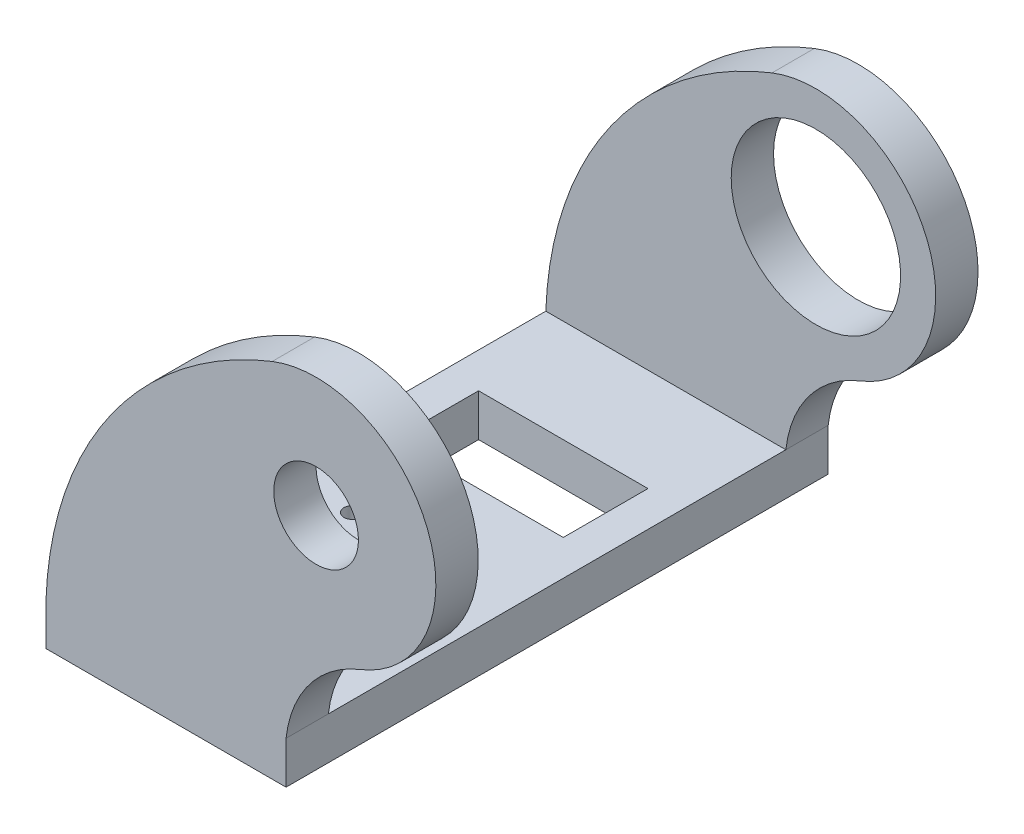
ISO-10303-21;
HEADER;
FILE_DESCRIPTION(('STEP AP214'),'2;1');
FILE_NAME('part.step','',(''),(''),'','','');
FILE_SCHEMA(('AUTOMOTIVE_DESIGN { 1 0 10303 214 1 1 1 1 }'));
ENDSEC;
DATA;
#1=APPLICATION_CONTEXT('core data for automotive mechanical design processes');
#2=APPLICATION_PROTOCOL_DEFINITION('international standard','automotive_design',2000,#1);
#3=PRODUCT_CONTEXT('',#1,'mechanical');
#4=PRODUCT('Part','Part','',(#3));
#5=PRODUCT_RELATED_PRODUCT_CATEGORY('part','',(#4));
#6=PRODUCT_DEFINITION_FORMATION('','',#4);
#7=PRODUCT_DEFINITION_CONTEXT('part definition',#1,'design');
#8=PRODUCT_DEFINITION('design','',#6,#7);
#9=PRODUCT_DEFINITION_SHAPE('','',#8);
#10=(LENGTH_UNIT() NAMED_UNIT(*) SI_UNIT(.MILLI.,.METRE.));
#11=(NAMED_UNIT(*) PLANE_ANGLE_UNIT() SI_UNIT($,.RADIAN.));
#12=(NAMED_UNIT(*) SI_UNIT($,.STERADIAN.) SOLID_ANGLE_UNIT());
#13=UNCERTAINTY_MEASURE_WITH_UNIT(LENGTH_MEASURE(1.E-05),#10,'distance_accuracy_value','');
#14=(GEOMETRIC_REPRESENTATION_CONTEXT(3) GLOBAL_UNCERTAINTY_ASSIGNED_CONTEXT((#13)) GLOBAL_UNIT_ASSIGNED_CONTEXT((#10,
#11,#12)) REPRESENTATION_CONTEXT('',''));
#15=CARTESIAN_POINT('',(0.,0.,0.));
#16=DIRECTION('',(0.,0.,1.));
#17=DIRECTION('',(1.,0.,0.));
#18=AXIS2_PLACEMENT_3D('',#15,#16,#17);
#19=CARTESIAN_POINT('',(57.0920106149906,42.9760565979538,0.));
#20=DIRECTION('',(0.,0.,1.));
#21=DIRECTION('',(1.,0.,0.));
#22=AXIS2_PLACEMENT_3D('',#19,#20,#21);
#23=PLANE('',#22);
#24=CARTESIAN_POINT('',(57.0920106149906,42.9760565979538,0.));
#25=DIRECTION('',(0.,0.,1.));
#26=DIRECTION('',(1.,0.,0.));
#27=AXIS2_PLACEMENT_3D('',#24,#25,#26);
#28=CIRCLE('',#27,5.);
#29=CARTESIAN_POINT('',(62.0920106149906,42.9760565979538,0.));
#30=VERTEX_POINT('',#29);
#31=EDGE_CURVE('E113',#30,#30,#28,.T.);
#32=ORIENTED_EDGE('',*,*,#31,.T.);
#33=EDGE_LOOP('',(#32));
#34=FACE_BOUND('',#33,.T.);
#35=DIRECTION('',(1.,0.,0.));
#36=VECTOR('',#35,1.);
#37=CARTESIAN_POINT('',(53.5458981834254,18.4188091808227,0.));
#38=LINE('',#37,#36);
#39=CARTESIAN_POINT('',(25.2039720357752,18.4188091808227,0.));
#40=VERTEX_POINT('',#39);
#41=CARTESIAN_POINT('',(53.5458981834254,18.4188091808227,0.));
#42=VERTEX_POINT('',#41);
#43=EDGE_CURVE('E141',#40,#42,#38,.T.);
#44=ORIENTED_EDGE('',*,*,#43,.F.);
#45=CARTESIAN_POINT('',(67.3687465397218,16.8754771948611,0.));
#46=DIRECTION('',(0.,0.,1.));
#47=DIRECTION('',(1.,0.,0.));
#48=AXIS2_PLACEMENT_3D('',#45,#46,#47);
#49=CIRCLE('',#48,42.1930098782673);
#50=CARTESIAN_POINT('',(51.910888918104,56.1349310924557,0.));
#51=VERTEX_POINT('',#50);
#52=EDGE_CURVE('E65',#51,#40,#49,.T.);
#53=ORIENTED_EDGE('',*,*,#52,.F.);
#54=CARTESIAN_POINT('',(57.0920106149906,42.9760565979538,0.));
#55=DIRECTION('',(0.,0.,1.));
#56=DIRECTION('',(1.,0.,0.));
#57=AXIS2_PLACEMENT_3D('',#54,#55,#56);
#58=CIRCLE('',#57,14.1421356237309);
#59=CARTESIAN_POINT('',(62.2731323118771,29.817182103452,0.));
#60=VERTEX_POINT('',#59);
#61=EDGE_CURVE('E116',#60,#51,#58,.T.);
#62=ORIENTED_EDGE('',*,*,#61,.F.);
#63=CARTESIAN_POINT('',(67.3687465397218,16.8754771948611,0.));
#64=DIRECTION('',(0.,0.,-1.));
#65=DIRECTION('',(1.,0.,0.));
#66=AXIS2_PLACEMENT_3D('',#63,#64,#65);
#67=CIRCLE('',#66,13.9087386308054);
#68=EDGE_CURVE('E119',#42,#60,#67,.T.);
#69=ORIENTED_EDGE('',*,*,#68,.F.);
#70=EDGE_LOOP('',(#44,#53,#62,#69));
#71=FACE_BOUND('',#70,.T.);
#72=ADVANCED_FACE('F36',(#34,#71),#23,.F.);
#73=CARTESIAN_POINT('',(57.0920106149906,42.9760565979538,5.));
#74=DIRECTION('',(0.,0.,-1.));
#75=DIRECTION('',(-1.,0.,0.));
#76=AXIS2_PLACEMENT_3D('',#73,#74,#75);
#77=CYLINDRICAL_SURFACE('',#76,14.1421356237309);
#78=ORIENTED_EDGE('',*,*,#61,.T.);
#79=DIRECTION('',(0.,0.,-1.));
#80=VECTOR('',#79,1.);
#81=CARTESIAN_POINT('',(51.910888918104,56.1349310924557,5.));
#82=LINE('',#81,#80);
#83=CARTESIAN_POINT('',(51.910888918104,56.1349310924557,5.));
#84=VERTEX_POINT('',#83);
#85=EDGE_CURVE('E11',#84,#51,#82,.T.);
#86=ORIENTED_EDGE('',*,*,#85,.F.);
#87=CARTESIAN_POINT('',(57.0920106149906,42.9760565979538,5.));
#88=DIRECTION('',(0.,0.,1.));
#89=DIRECTION('',(1.,0.,0.));
#90=AXIS2_PLACEMENT_3D('',#87,#88,#89);
#91=CIRCLE('',#90,14.1421356237309);
#92=CARTESIAN_POINT('',(62.2731323118771,29.817182103452,5.));
#93=VERTEX_POINT('',#92);
#94=EDGE_CURVE('E92',#93,#84,#91,.T.);
#95=ORIENTED_EDGE('',*,*,#94,.F.);
#96=DIRECTION('',(0.,0.,-1.));
#97=VECTOR('',#96,1.);
#98=CARTESIAN_POINT('',(62.2731323118771,29.817182103452,5.));
#99=LINE('',#98,#97);
#100=EDGE_CURVE('E122',#93,#60,#99,.T.);
#101=ORIENTED_EDGE('',*,*,#100,.T.);
#102=EDGE_LOOP('',(#78,#86,#95,#101));
#103=FACE_BOUND('',#102,.T.);
#104=ADVANCED_FACE('F38',(#103),#77,.T.);
#105=CARTESIAN_POINT('',(67.3687465397218,16.8754771948611,5.));
#106=DIRECTION('',(0.,0.,-1.));
#107=DIRECTION('',(-1.,0.,0.));
#108=AXIS2_PLACEMENT_3D('',#105,#106,#107);
#109=CYLINDRICAL_SURFACE('',#108,42.1930098782673);
#110=ORIENTED_EDGE('',*,*,#52,.T.);
#111=DIRECTION('',(0.,0.,-1.));
#112=VECTOR('',#111,1.);
#113=CARTESIAN_POINT('',(25.2039720357752,18.4188091808227,5.));
#114=LINE('',#113,#112);
#115=CARTESIAN_POINT('',(25.2039720357752,18.4188091808227,5.));
#116=VERTEX_POINT('',#115);
#117=EDGE_CURVE('E45',#116,#40,#114,.T.);
#118=ORIENTED_EDGE('',*,*,#117,.F.);
#119=CARTESIAN_POINT('',(67.3687465397218,16.8754771948611,5.));
#120=DIRECTION('',(0.,0.,1.));
#121=DIRECTION('',(1.,0.,0.));
#122=AXIS2_PLACEMENT_3D('',#119,#120,#121);
#123=CIRCLE('',#122,42.1930098782673);
#124=EDGE_CURVE('E85',#84,#116,#123,.T.);
#125=ORIENTED_EDGE('',*,*,#124,.F.);
#126=ORIENTED_EDGE('',*,*,#85,.T.);
#127=EDGE_LOOP('',(#110,#118,#125,#126));
#128=FACE_BOUND('',#127,.T.);
#129=ADVANCED_FACE('F97',(#128),#109,.T.);
#130=CARTESIAN_POINT('',(67.3687465397218,16.8754771948611,5.));
#131=DIRECTION('',(0.,0.,-1.));
#132=DIRECTION('',(-1.,0.,0.));
#133=AXIS2_PLACEMENT_3D('',#130,#131,#132);
#134=CYLINDRICAL_SURFACE('',#133,13.9087386308054);
#135=ORIENTED_EDGE('',*,*,#68,.T.);
#136=ORIENTED_EDGE('',*,*,#100,.F.);
#137=CARTESIAN_POINT('',(67.3687465397218,16.8754771948611,5.));
#138=DIRECTION('',(0.,0.,-1.));
#139=DIRECTION('',(1.,0.,0.));
#140=AXIS2_PLACEMENT_3D('',#137,#138,#139);
#141=CIRCLE('',#140,13.9087386308054);
#142=CARTESIAN_POINT('',(53.5458981834254,18.4188091808227,5.));
#143=VERTEX_POINT('',#142);
#144=EDGE_CURVE('E53',#143,#93,#141,.T.);
#145=ORIENTED_EDGE('',*,*,#144,.F.);
#146=DIRECTION('',(0.,0.,-1.));
#147=VECTOR('',#146,1.);
#148=CARTESIAN_POINT('',(53.5458981834254,18.4188091808227,5.));
#149=LINE('',#148,#147);
#150=EDGE_CURVE('E101',#143,#42,#149,.T.);
#151=ORIENTED_EDGE('',*,*,#150,.T.);
#152=EDGE_LOOP('',(#135,#136,#145,#151));
#153=FACE_BOUND('',#152,.T.);
#154=ADVANCED_FACE('F133',(#153),#134,.F.);
#155=CARTESIAN_POINT('',(57.0920106149906,42.9760565979538,5.));
#156=DIRECTION('',(0.,0.,1.));
#157=DIRECTION('',(1.,0.,0.));
#158=AXIS2_PLACEMENT_3D('',#155,#156,#157);
#159=PLANE('',#158);
#160=CARTESIAN_POINT('',(57.0920106149906,42.9760565979538,5.));
#161=DIRECTION('',(0.,0.,1.));
#162=DIRECTION('',(1.,0.,0.));
#163=AXIS2_PLACEMENT_3D('',#160,#161,#162);
#164=CIRCLE('',#163,5.);
#165=CARTESIAN_POINT('',(62.0920106149906,42.9760565979538,5.));
#166=VERTEX_POINT('',#165);
#167=EDGE_CURVE('E107',#166,#166,#164,.T.);
#168=ORIENTED_EDGE('',*,*,#167,.F.);
#169=EDGE_LOOP('',(#168));
#170=FACE_BOUND('',#169,.T.);
#171=ORIENTED_EDGE('',*,*,#94,.T.);
#172=ORIENTED_EDGE('',*,*,#124,.T.);
#173=DIRECTION('',(0.,1.,0.));
#174=VECTOR('',#173,1.);
#175=CARTESIAN_POINT('',(25.2039720357752,13.4188091808227,5.));
#176=LINE('',#175,#174);
#177=CARTESIAN_POINT('',(25.2039720357752,13.4188091808227,5.));
#178=VERTEX_POINT('',#177);
#179=EDGE_CURVE('E89',#178,#116,#176,.T.);
#180=ORIENTED_EDGE('',*,*,#179,.F.);
#181=DIRECTION('',(-1.,0.,0.));
#182=VECTOR('',#181,1.);
#183=CARTESIAN_POINT('',(53.5458981834254,13.4188091808227,5.));
#184=LINE('',#183,#182);
#185=CARTESIAN_POINT('',(53.5458981834254,13.4188091808227,5.));
#186=VERTEX_POINT('',#185);
#187=EDGE_CURVE('E75',#186,#178,#184,.T.);
#188=ORIENTED_EDGE('',*,*,#187,.F.);
#189=DIRECTION('',(0.,1.,0.));
#190=VECTOR('',#189,1.);
#191=CARTESIAN_POINT('',(53.5458981834254,13.4188091808227,5.));
#192=LINE('',#191,#190);
#193=EDGE_CURVE('E105',#186,#143,#192,.T.);
#194=ORIENTED_EDGE('',*,*,#193,.T.);
#195=ORIENTED_EDGE('',*,*,#144,.T.);
#196=EDGE_LOOP('',(#171,#172,#180,#188,#194,#195));
#197=FACE_BOUND('',#196,.T.);
#198=ADVANCED_FACE('F87',(#170,#197),#159,.T.);
#199=CARTESIAN_POINT('',(57.0920106149906,42.9760565979538,0.));
#200=DIRECTION('',(0.,0.,1.));
#201=DIRECTION('',(1.,0.,0.));
#202=AXIS2_PLACEMENT_3D('',#199,#200,#201);
#203=CYLINDRICAL_SURFACE('',#202,5.);
#204=ORIENTED_EDGE('',*,*,#31,.F.);
#205=EDGE_LOOP('',(#204));
#206=FACE_BOUND('',#205,.T.);
#207=ORIENTED_EDGE('',*,*,#167,.T.);
#208=EDGE_LOOP('',(#207));
#209=FACE_BOUND('',#208,.T.);
#210=ADVANCED_FACE('F344',(#206,#209),#203,.F.);
#211=CARTESIAN_POINT('',(25.2039720357752,13.4188091808227,5.));
#212=DIRECTION('',(1.,0.,0.));
#213=DIRECTION('',(0.,0.,-1.));
#214=AXIS2_PLACEMENT_3D('',#211,#212,#213);
#215=PLANE('',#214);
#216=ORIENTED_EDGE('',*,*,#117,.T.);
#217=DIRECTION('',(0.,0.,1.));
#218=VECTOR('',#217,1.);
#219=CARTESIAN_POINT('',(25.2039720357752,18.4188091808227,-31.9));
#220=LINE('',#219,#218);
#221=CARTESIAN_POINT('',(25.2039720357752,18.4188091808227,-54.01));
#222=VERTEX_POINT('',#221);
#223=EDGE_CURVE('E147',#222,#40,#220,.T.);
#224=ORIENTED_EDGE('',*,*,#223,.F.);
#225=DIRECTION('',(0.,0.,1.));
#226=VECTOR('',#225,1.);
#227=CARTESIAN_POINT('',(25.2039720357752,18.4188091808227,-59.01));
#228=LINE('',#227,#226);
#229=CARTESIAN_POINT('',(25.2039720357752,18.4188091808227,-59.01));
#230=VERTEX_POINT('',#229);
#231=EDGE_CURVE('E207',#230,#222,#228,.T.);
#232=ORIENTED_EDGE('',*,*,#231,.F.);
#233=DIRECTION('',(0.,1.,0.));
#234=VECTOR('',#233,1.);
#235=CARTESIAN_POINT('',(25.2039720357752,18.4188091808227,-59.01));
#236=LINE('',#235,#234);
#237=CARTESIAN_POINT('',(25.2039720357752,13.4188091808227,-59.01));
#238=VERTEX_POINT('',#237);
#239=EDGE_CURVE('E181',#238,#230,#236,.T.);
#240=ORIENTED_EDGE('',*,*,#239,.F.);
#241=DIRECTION('',(0.,0.,-1.));
#242=VECTOR('',#241,1.);
#243=CARTESIAN_POINT('',(25.2039720357752,13.4188091808227,5.));
#244=LINE('',#243,#242);
#245=EDGE_CURVE('E104',#178,#238,#244,.T.);
#246=ORIENTED_EDGE('',*,*,#245,.F.);
#247=ORIENTED_EDGE('',*,*,#179,.T.);
#248=EDGE_LOOP('',(#216,#224,#232,#240,#246,#247));
#249=FACE_BOUND('',#248,.T.);
#250=ADVANCED_FACE('F102',(#249),#215,.F.);
#251=CARTESIAN_POINT('',(53.5458981834254,13.4188091808227,0.));
#252=DIRECTION('',(-1.,0.,0.));
#253=DIRECTION('',(0.,0.,1.));
#254=AXIS2_PLACEMENT_3D('',#251,#252,#253);
#255=PLANE('',#254);
#256=ORIENTED_EDGE('',*,*,#150,.F.);
#257=ORIENTED_EDGE('',*,*,#193,.F.);
#258=DIRECTION('',(0.,0.,1.));
#259=VECTOR('',#258,1.);
#260=CARTESIAN_POINT('',(53.5458981834254,13.4188091808227,0.));
#261=LINE('',#260,#259);
#262=CARTESIAN_POINT('',(53.5458981834254,13.4188091808227,-59.01));
#263=VERTEX_POINT('',#262);
#264=EDGE_CURVE('E109',#263,#186,#261,.T.);
#265=ORIENTED_EDGE('',*,*,#264,.F.);
#266=DIRECTION('',(0.,-1.,0.));
#267=VECTOR('',#266,1.);
#268=CARTESIAN_POINT('',(53.5458981834254,18.4188091808227,-59.01));
#269=LINE('',#268,#267);
#270=CARTESIAN_POINT('',(53.5458981834254,18.4188091808227,-59.01));
#271=VERTEX_POINT('',#270);
#272=EDGE_CURVE('E169',#271,#263,#269,.T.);
#273=ORIENTED_EDGE('',*,*,#272,.F.);
#274=DIRECTION('',(0.,0.,1.));
#275=VECTOR('',#274,1.);
#276=CARTESIAN_POINT('',(53.5458981834254,18.4188091808227,-59.01));
#277=LINE('',#276,#275);
#278=CARTESIAN_POINT('',(53.5458981834254,18.4188091808227,-54.01));
#279=VERTEX_POINT('',#278);
#280=EDGE_CURVE('E154',#271,#279,#277,.T.);
#281=ORIENTED_EDGE('',*,*,#280,.T.);
#282=DIRECTION('',(0.,0.,1.));
#283=VECTOR('',#282,1.);
#284=CARTESIAN_POINT('',(53.5458981834254,18.4188091808227,-31.9));
#285=LINE('',#284,#283);
#286=EDGE_CURVE('E145',#279,#42,#285,.T.);
#287=ORIENTED_EDGE('',*,*,#286,.T.);
#288=EDGE_LOOP('',(#256,#257,#265,#273,#281,#287));
#289=FACE_BOUND('',#288,.T.);
#290=ADVANCED_FACE('F151',(#289),#255,.F.);
#291=CARTESIAN_POINT('',(0.,13.4188091808227,0.));
#292=DIRECTION('',(0.,-1.,0.));
#293=DIRECTION('',(0.,0.,-1.));
#294=AXIS2_PLACEMENT_3D('',#291,#292,#293);
#295=PLANE('',#294);
#296=CARTESIAN_POINT('',(44.3749351096003,13.4188091808227,-22.));
#297=DIRECTION('',(0.,-1.,0.));
#298=DIRECTION('',(0.,0.,-1.));
#299=AXIS2_PLACEMENT_3D('',#296,#297,#298);
#300=CIRCLE('',#299,0.999999999999998);
#301=CARTESIAN_POINT('',(44.3749351096003,13.4188091808227,-23.));
#302=VERTEX_POINT('',#301);
#303=EDGE_CURVE('E232',#302,#302,#300,.T.);
#304=ORIENTED_EDGE('',*,*,#303,.F.);
#305=EDGE_LOOP('',(#304));
#306=FACE_BOUND('',#305,.T.);
#307=CARTESIAN_POINT('',(34.3749351096003,13.4188091808227,-15.));
#308=DIRECTION('',(0.,-1.,0.));
#309=DIRECTION('',(0.,0.,-1.));
#310=AXIS2_PLACEMENT_3D('',#307,#308,#309);
#311=CIRCLE('',#310,0.999999999999998);
#312=CARTESIAN_POINT('',(34.3749351096003,13.4188091808227,-16.));
#313=VERTEX_POINT('',#312);
#314=EDGE_CURVE('E229',#313,#313,#311,.T.);
#315=ORIENTED_EDGE('',*,*,#314,.F.);
#316=EDGE_LOOP('',(#315));
#317=FACE_BOUND('',#316,.T.);
#318=CARTESIAN_POINT('',(44.3749351096003,13.4188091808227,-15.));
#319=DIRECTION('',(0.,-1.,0.));
#320=DIRECTION('',(0.,0.,-1.));
#321=AXIS2_PLACEMENT_3D('',#318,#319,#320);
#322=CIRCLE('',#321,0.999999999999998);
#323=CARTESIAN_POINT('',(44.3749351096003,13.4188091808227,-16.));
#324=VERTEX_POINT('',#323);
#325=EDGE_CURVE('E226',#324,#324,#322,.T.);
#326=ORIENTED_EDGE('',*,*,#325,.F.);
#327=EDGE_LOOP('',(#326));
#328=FACE_BOUND('',#327,.T.);
#329=CARTESIAN_POINT('',(34.3749351096003,13.4188091808227,-22.));
#330=DIRECTION('',(0.,-1.,0.));
#331=DIRECTION('',(0.,0.,-1.));
#332=AXIS2_PLACEMENT_3D('',#329,#330,#331);
#333=CIRCLE('',#332,0.999999999999998);
#334=CARTESIAN_POINT('',(34.3749351096003,13.4188091808227,-23.));
#335=VERTEX_POINT('',#334);
#336=EDGE_CURVE('E223',#335,#335,#333,.T.);
#337=ORIENTED_EDGE('',*,*,#336,.F.);
#338=EDGE_LOOP('',(#337));
#339=FACE_BOUND('',#338,.T.);
#340=ORIENTED_EDGE('',*,*,#245,.T.);
#341=DIRECTION('',(-1.,0.,0.));
#342=VECTOR('',#341,1.);
#343=CARTESIAN_POINT('',(53.5458981834254,13.4188091808227,-59.01));
#344=LINE('',#343,#342);
#345=EDGE_CURVE('E166',#263,#238,#344,.T.);
#346=ORIENTED_EDGE('',*,*,#345,.F.);
#347=ORIENTED_EDGE('',*,*,#264,.T.);
#348=ORIENTED_EDGE('',*,*,#187,.T.);
#349=EDGE_LOOP('',(#340,#346,#347,#348));
#350=FACE_BOUND('',#349,.T.);
#351=DIRECTION('',(-1.,0.,0.));
#352=VECTOR('',#351,1.);
#353=CARTESIAN_POINT('',(49.3749351096003,13.4188091808227,-31.9));
#354=LINE('',#353,#352);
#355=CARTESIAN_POINT('',(49.3749351096003,13.4188091808227,-31.9));
#356=VERTEX_POINT('',#355);
#357=CARTESIAN_POINT('',(29.3749351096003,13.4188091808227,-31.9));
#358=VERTEX_POINT('',#357);
#359=EDGE_CURVE('E252',#356,#358,#354,.T.);
#360=ORIENTED_EDGE('',*,*,#359,.F.);
#361=DIRECTION('',(0.,0.,-1.));
#362=VECTOR('',#361,1.);
#363=CARTESIAN_POINT('',(49.3749351096003,13.4188091808227,-26.9));
#364=LINE('',#363,#362);
#365=CARTESIAN_POINT('',(49.3749351096003,13.4188091808227,-41.9));
#366=VERTEX_POINT('',#365);
#367=EDGE_CURVE('E148',#356,#366,#364,.T.);
#368=ORIENTED_EDGE('',*,*,#367,.T.);
#369=DIRECTION('',(-1.,0.,0.));
#370=VECTOR('',#369,1.);
#371=CARTESIAN_POINT('',(53.5458981834254,13.4188091808227,-41.9));
#372=LINE('',#371,#370);
#373=CARTESIAN_POINT('',(29.3749351096003,13.4188091808227,-41.9));
#374=VERTEX_POINT('',#373);
#375=EDGE_CURVE('E235',#366,#374,#372,.T.);
#376=ORIENTED_EDGE('',*,*,#375,.T.);
#377=DIRECTION('',(0.,0.,1.));
#378=VECTOR('',#377,1.);
#379=CARTESIAN_POINT('',(29.3749351096003,13.4188091808227,-26.9));
#380=LINE('',#379,#378);
#381=EDGE_CURVE('E262',#374,#358,#380,.T.);
#382=ORIENTED_EDGE('',*,*,#381,.T.);
#383=EDGE_LOOP('',(#360,#368,#376,#382));
#384=FACE_BOUND('',#383,.T.);
#385=ADVANCED_FACE('F162',(#306,#317,#328,#339,#350,#384),#295,.T.);
#386=CARTESIAN_POINT('',(53.5458981834254,18.4188091808227,-31.9));
#387=DIRECTION('',(0.,-1.,0.));
#388=DIRECTION('',(0.,0.,-1.));
#389=AXIS2_PLACEMENT_3D('',#386,#387,#388);
#390=PLANE('',#389);
#391=CARTESIAN_POINT('',(44.3749351096003,18.4188091808227,-22.));
#392=DIRECTION('',(0.,1.,0.));
#393=DIRECTION('',(0.,0.,1.));
#394=AXIS2_PLACEMENT_3D('',#391,#392,#393);
#395=CIRCLE('',#394,0.999999999999998);
#396=CARTESIAN_POINT('',(44.3749351096003,18.4188091808227,-21.));
#397=VERTEX_POINT('',#396);
#398=EDGE_CURVE('E215',#397,#397,#395,.T.);
#399=ORIENTED_EDGE('',*,*,#398,.F.);
#400=EDGE_LOOP('',(#399));
#401=FACE_BOUND('',#400,.T.);
#402=CARTESIAN_POINT('',(34.3749351096003,18.4188091808227,-15.));
#403=DIRECTION('',(0.,1.,0.));
#404=DIRECTION('',(0.,0.,1.));
#405=AXIS2_PLACEMENT_3D('',#402,#403,#404);
#406=CIRCLE('',#405,0.999999999999998);
#407=CARTESIAN_POINT('',(34.3749351096003,18.4188091808227,-14.));
#408=VERTEX_POINT('',#407);
#409=EDGE_CURVE('E214',#408,#408,#406,.T.);
#410=ORIENTED_EDGE('',*,*,#409,.F.);
#411=EDGE_LOOP('',(#410));
#412=FACE_BOUND('',#411,.T.);
#413=CARTESIAN_POINT('',(44.3749351096003,18.4188091808227,-15.));
#414=DIRECTION('',(0.,1.,0.));
#415=DIRECTION('',(0.,0.,1.));
#416=AXIS2_PLACEMENT_3D('',#413,#414,#415);
#417=CIRCLE('',#416,0.999999999999998);
#418=CARTESIAN_POINT('',(44.3749351096003,18.4188091808227,-14.));
#419=VERTEX_POINT('',#418);
#420=EDGE_CURVE('E211',#419,#419,#417,.T.);
#421=ORIENTED_EDGE('',*,*,#420,.F.);
#422=EDGE_LOOP('',(#421));
#423=FACE_BOUND('',#422,.T.);
#424=CARTESIAN_POINT('',(34.3749351096003,18.4188091808227,-22.));
#425=DIRECTION('',(0.,1.,0.));
#426=DIRECTION('',(0.,0.,1.));
#427=AXIS2_PLACEMENT_3D('',#424,#425,#426);
#428=CIRCLE('',#427,0.999999999999998);
#429=CARTESIAN_POINT('',(34.3749351096003,18.4188091808227,-21.));
#430=VERTEX_POINT('',#429);
#431=EDGE_CURVE('E218',#430,#430,#428,.T.);
#432=ORIENTED_EDGE('',*,*,#431,.F.);
#433=EDGE_LOOP('',(#432));
#434=FACE_BOUND('',#433,.T.);
#435=DIRECTION('',(0.,0.,1.));
#436=VECTOR('',#435,1.);
#437=CARTESIAN_POINT('',(29.3749351096003,18.4188091808227,-26.9));
#438=LINE('',#437,#436);
#439=CARTESIAN_POINT('',(29.3749351096003,18.4188091808227,-41.9));
#440=VERTEX_POINT('',#439);
#441=CARTESIAN_POINT('',(29.3749351096003,18.4188091808227,-31.9));
#442=VERTEX_POINT('',#441);
#443=EDGE_CURVE('E261',#440,#442,#438,.T.);
#444=ORIENTED_EDGE('',*,*,#443,.F.);
#445=DIRECTION('',(1.,0.,0.));
#446=VECTOR('',#445,1.);
#447=CARTESIAN_POINT('',(53.5458981834254,18.4188091808227,-41.9));
#448=LINE('',#447,#446);
#449=CARTESIAN_POINT('',(49.3749351096003,18.4188091808227,-41.9));
#450=VERTEX_POINT('',#449);
#451=EDGE_CURVE('E239',#440,#450,#448,.T.);
#452=ORIENTED_EDGE('',*,*,#451,.T.);
#453=DIRECTION('',(0.,0.,-1.));
#454=VECTOR('',#453,1.);
#455=CARTESIAN_POINT('',(49.3749351096003,18.4188091808227,-26.9));
#456=LINE('',#455,#454);
#457=CARTESIAN_POINT('',(49.3749351096003,18.4188091808227,-31.9));
#458=VERTEX_POINT('',#457);
#459=EDGE_CURVE('E265',#458,#450,#456,.T.);
#460=ORIENTED_EDGE('',*,*,#459,.F.);
#461=DIRECTION('',(1.,0.,0.));
#462=VECTOR('',#461,1.);
#463=CARTESIAN_POINT('',(29.3749351096003,18.4188091808227,-31.9));
#464=LINE('',#463,#462);
#465=EDGE_CURVE('E246',#442,#458,#464,.T.);
#466=ORIENTED_EDGE('',*,*,#465,.F.);
#467=EDGE_LOOP('',(#444,#452,#460,#466));
#468=FACE_BOUND('',#467,.T.);
#469=DIRECTION('',(1.,0.,0.));
#470=VECTOR('',#469,1.);
#471=CARTESIAN_POINT('',(53.5458981834254,18.4188091808227,-54.01));
#472=LINE('',#471,#470);
#473=EDGE_CURVE('E236',#222,#279,#472,.T.);
#474=ORIENTED_EDGE('',*,*,#473,.F.);
#475=ORIENTED_EDGE('',*,*,#223,.T.);
#476=ORIENTED_EDGE('',*,*,#43,.T.);
#477=ORIENTED_EDGE('',*,*,#286,.F.);
#478=EDGE_LOOP('',(#474,#475,#476,#477));
#479=FACE_BOUND('',#478,.T.);
#480=ADVANCED_FACE('F143',(#401,#412,#423,#434,#468,#479),#390,.F.);
#481=CARTESIAN_POINT('',(29.3749351096003,13.4188091808227,-26.9));
#482=DIRECTION('',(-1.,0.,0.));
#483=DIRECTION('',(0.,0.,1.));
#484=AXIS2_PLACEMENT_3D('',#481,#482,#483);
#485=PLANE('',#484);
#486=ORIENTED_EDGE('',*,*,#443,.T.);
#487=DIRECTION('',(0.,1.,0.));
#488=VECTOR('',#487,1.);
#489=CARTESIAN_POINT('',(29.3749351096003,13.4188091808227,-31.9));
#490=LINE('',#489,#488);
#491=EDGE_CURVE('E238',#358,#442,#490,.T.);
#492=ORIENTED_EDGE('',*,*,#491,.F.);
#493=ORIENTED_EDGE('',*,*,#381,.F.);
#494=DIRECTION('',(0.,-1.,0.));
#495=VECTOR('',#494,1.);
#496=CARTESIAN_POINT('',(29.3749351096003,18.4188091808227,-41.9));
#497=LINE('',#496,#495);
#498=EDGE_CURVE('E258',#440,#374,#497,.T.);
#499=ORIENTED_EDGE('',*,*,#498,.F.);
#500=EDGE_LOOP('',(#486,#492,#493,#499));
#501=FACE_BOUND('',#500,.T.);
#502=ADVANCED_FACE('F294',(#501),#485,.F.);
#503=CARTESIAN_POINT('',(49.3749351096003,13.4188091808227,-26.9));
#504=DIRECTION('',(1.,0.,0.));
#505=DIRECTION('',(0.,0.,-1.));
#506=AXIS2_PLACEMENT_3D('',#503,#504,#505);
#507=PLANE('',#506);
#508=ORIENTED_EDGE('',*,*,#367,.F.);
#509=DIRECTION('',(0.,-1.,0.));
#510=VECTOR('',#509,1.);
#511=CARTESIAN_POINT('',(49.3749351096003,18.4188091808227,-31.9));
#512=LINE('',#511,#510);
#513=EDGE_CURVE('E249',#458,#356,#512,.T.);
#514=ORIENTED_EDGE('',*,*,#513,.F.);
#515=ORIENTED_EDGE('',*,*,#459,.T.);
#516=DIRECTION('',(0.,1.,0.));
#517=VECTOR('',#516,1.);
#518=CARTESIAN_POINT('',(49.3749351096003,18.4188091808227,-41.9));
#519=LINE('',#518,#517);
#520=EDGE_CURVE('E255',#366,#450,#519,.T.);
#521=ORIENTED_EDGE('',*,*,#520,.F.);
#522=EDGE_LOOP('',(#508,#514,#515,#521));
#523=FACE_BOUND('',#522,.T.);
#524=ADVANCED_FACE('F276',(#523),#507,.F.);
#525=CARTESIAN_POINT('',(0.,0.,-31.9));
#526=DIRECTION('',(0.,0.,-1.));
#527=DIRECTION('',(-1.,0.,0.));
#528=AXIS2_PLACEMENT_3D('',#525,#526,#527);
#529=PLANE('',#528);
#530=ORIENTED_EDGE('',*,*,#491,.T.);
#531=ORIENTED_EDGE('',*,*,#465,.T.);
#532=ORIENTED_EDGE('',*,*,#513,.T.);
#533=ORIENTED_EDGE('',*,*,#359,.T.);
#534=EDGE_LOOP('',(#530,#531,#532,#533));
#535=FACE_BOUND('',#534,.T.);
#536=ADVANCED_FACE('F307',(#535),#529,.T.);
#537=CARTESIAN_POINT('',(0.,0.,-41.9));
#538=DIRECTION('',(0.,0.,-1.));
#539=DIRECTION('',(-1.,0.,0.));
#540=AXIS2_PLACEMENT_3D('',#537,#538,#539);
#541=PLANE('',#540);
#542=ORIENTED_EDGE('',*,*,#451,.F.);
#543=ORIENTED_EDGE('',*,*,#498,.T.);
#544=ORIENTED_EDGE('',*,*,#375,.F.);
#545=ORIENTED_EDGE('',*,*,#520,.T.);
#546=EDGE_LOOP('',(#542,#543,#544,#545));
#547=FACE_BOUND('',#546,.T.);
#548=ADVANCED_FACE('F285',(#547),#541,.F.);
#549=CARTESIAN_POINT('',(34.3749351096003,6.30880918082268,-22.));
#550=DIRECTION('',(0.,1.,0.));
#551=DIRECTION('',(0.,0.,1.));
#552=AXIS2_PLACEMENT_3D('',#549,#550,#551);
#553=CYLINDRICAL_SURFACE('',#552,0.999999999999998);
#554=ORIENTED_EDGE('',*,*,#336,.T.);
#555=EDGE_LOOP('',(#554));
#556=FACE_BOUND('',#555,.T.);
#557=ORIENTED_EDGE('',*,*,#431,.T.);
#558=EDGE_LOOP('',(#557));
#559=FACE_BOUND('',#558,.T.);
#560=ADVANCED_FACE('F314',(#556,#559),#553,.F.);
#561=CARTESIAN_POINT('',(44.3749351096003,6.30880918082268,-15.));
#562=DIRECTION('',(0.,1.,0.));
#563=DIRECTION('',(0.,0.,1.));
#564=AXIS2_PLACEMENT_3D('',#561,#562,#563);
#565=CYLINDRICAL_SURFACE('',#564,0.999999999999998);
#566=ORIENTED_EDGE('',*,*,#325,.T.);
#567=EDGE_LOOP('',(#566));
#568=FACE_BOUND('',#567,.T.);
#569=ORIENTED_EDGE('',*,*,#420,.T.);
#570=EDGE_LOOP('',(#569));
#571=FACE_BOUND('',#570,.T.);
#572=ADVANCED_FACE('F405',(#568,#571),#565,.F.);
#573=CARTESIAN_POINT('',(34.3749351096003,6.30880918082268,-15.));
#574=DIRECTION('',(0.,1.,0.));
#575=DIRECTION('',(0.,0.,1.));
#576=AXIS2_PLACEMENT_3D('',#573,#574,#575);
#577=CYLINDRICAL_SURFACE('',#576,0.999999999999998);
#578=ORIENTED_EDGE('',*,*,#314,.T.);
#579=EDGE_LOOP('',(#578));
#580=FACE_BOUND('',#579,.T.);
#581=ORIENTED_EDGE('',*,*,#409,.T.);
#582=EDGE_LOOP('',(#581));
#583=FACE_BOUND('',#582,.T.);
#584=ADVANCED_FACE('F415',(#580,#583),#577,.F.);
#585=CARTESIAN_POINT('',(44.3749351096003,6.30880918082268,-22.));
#586=DIRECTION('',(0.,1.,0.));
#587=DIRECTION('',(0.,0.,1.));
#588=AXIS2_PLACEMENT_3D('',#585,#586,#587);
#589=CYLINDRICAL_SURFACE('',#588,0.999999999999998);
#590=ORIENTED_EDGE('',*,*,#303,.T.);
#591=EDGE_LOOP('',(#590));
#592=FACE_BOUND('',#591,.T.);
#593=ORIENTED_EDGE('',*,*,#398,.T.);
#594=EDGE_LOOP('',(#593));
#595=FACE_BOUND('',#594,.T.);
#596=ADVANCED_FACE('F424',(#592,#595),#589,.F.);
#597=CARTESIAN_POINT('',(67.3687465397218,16.8754771948611,-59.01));
#598=DIRECTION('',(0.,0.,-1.));
#599=DIRECTION('',(-1.,0.,0.));
#600=AXIS2_PLACEMENT_3D('',#597,#598,#599);
#601=PLANE('',#600);
#602=CARTESIAN_POINT('',(67.3687465397218,16.8754771948611,-59.01));
#603=DIRECTION('',(0.,0.,1.));
#604=DIRECTION('',(-1.,0.,0.));
#605=AXIS2_PLACEMENT_3D('',#602,#603,#604);
#606=CIRCLE('',#605,13.9087386308054);
#607=CARTESIAN_POINT('',(62.2731323118771,29.817182103452,-59.01));
#608=VERTEX_POINT('',#607);
#609=EDGE_CURVE('E179',#608,#271,#606,.T.);
#610=ORIENTED_EDGE('',*,*,#609,.T.);
#611=ORIENTED_EDGE('',*,*,#272,.T.);
#612=ORIENTED_EDGE('',*,*,#345,.T.);
#613=ORIENTED_EDGE('',*,*,#239,.T.);
#614=CARTESIAN_POINT('',(67.3687465397218,16.8754771948611,-59.01));
#615=DIRECTION('',(0.,0.,-1.));
#616=DIRECTION('',(-1.,0.,0.));
#617=AXIS2_PLACEMENT_3D('',#614,#615,#616);
#618=CIRCLE('',#617,42.1930098782673);
#619=CARTESIAN_POINT('',(51.910888918104,56.1349310924557,-59.01));
#620=VERTEX_POINT('',#619);
#621=EDGE_CURVE('E188',#230,#620,#618,.T.);
#622=ORIENTED_EDGE('',*,*,#621,.T.);
#623=CARTESIAN_POINT('',(57.0920106149906,42.9760565979538,-59.01));
#624=DIRECTION('',(0.,0.,-1.));
#625=DIRECTION('',(-1.,0.,0.));
#626=AXIS2_PLACEMENT_3D('',#623,#624,#625);
#627=CIRCLE('',#626,14.1421356237309);
#628=EDGE_CURVE('E191',#620,#608,#627,.T.);
#629=ORIENTED_EDGE('',*,*,#628,.T.);
#630=EDGE_LOOP('',(#610,#611,#612,#613,#622,#629));
#631=FACE_BOUND('',#630,.T.);
#632=CARTESIAN_POINT('',(57.0920106149906,42.9760565979538,-59.01));
#633=DIRECTION('',(0.,0.,-1.));
#634=DIRECTION('',(-1.,0.,0.));
#635=AXIS2_PLACEMENT_3D('',#632,#633,#634);
#636=CIRCLE('',#635,10.);
#637=CARTESIAN_POINT('',(47.0920106149906,42.9760565979538,-59.01));
#638=VERTEX_POINT('',#637);
#639=EDGE_CURVE('E197',#638,#638,#636,.T.);
#640=ORIENTED_EDGE('',*,*,#639,.F.);
#641=EDGE_LOOP('',(#640));
#642=FACE_BOUND('',#641,.T.);
#643=ADVANCED_FACE('F174',(#631,#642),#601,.T.);
#644=CARTESIAN_POINT('',(67.3687465397218,16.8754771948611,-54.01));
#645=DIRECTION('',(0.,0.,-1.));
#646=DIRECTION('',(-1.,0.,0.));
#647=AXIS2_PLACEMENT_3D('',#644,#645,#646);
#648=PLANE('',#647);
#649=CARTESIAN_POINT('',(67.3687465397218,16.8754771948611,-54.01));
#650=DIRECTION('',(0.,0.,-1.));
#651=DIRECTION('',(-1.,0.,0.));
#652=AXIS2_PLACEMENT_3D('',#649,#650,#651);
#653=CIRCLE('',#652,42.1930098782673);
#654=CARTESIAN_POINT('',(51.910888918104,56.1349310924557,-54.01));
#655=VERTEX_POINT('',#654);
#656=EDGE_CURVE('E196',#222,#655,#653,.T.);
#657=ORIENTED_EDGE('',*,*,#656,.F.);
#658=ORIENTED_EDGE('',*,*,#473,.T.);
#659=CARTESIAN_POINT('',(67.3687465397218,16.8754771948611,-54.01));
#660=DIRECTION('',(0.,0.,1.));
#661=DIRECTION('',(-1.,0.,0.));
#662=AXIS2_PLACEMENT_3D('',#659,#660,#661);
#663=CIRCLE('',#662,13.9087386308054);
#664=CARTESIAN_POINT('',(62.2731323118771,29.817182103452,-54.01));
#665=VERTEX_POINT('',#664);
#666=EDGE_CURVE('E194',#665,#279,#663,.T.);
#667=ORIENTED_EDGE('',*,*,#666,.F.);
#668=CARTESIAN_POINT('',(57.0920106149906,42.9760565979538,-54.01));
#669=DIRECTION('',(0.,0.,-1.));
#670=DIRECTION('',(-1.,0.,0.));
#671=AXIS2_PLACEMENT_3D('',#668,#669,#670);
#672=CIRCLE('',#671,14.1421356237309);
#673=EDGE_CURVE('E183',#655,#665,#672,.T.);
#674=ORIENTED_EDGE('',*,*,#673,.F.);
#675=EDGE_LOOP('',(#657,#658,#667,#674));
#676=FACE_BOUND('',#675,.T.);
#677=CARTESIAN_POINT('',(57.0920106149906,42.9760565979538,-54.01));
#678=DIRECTION('',(0.,0.,-1.));
#679=DIRECTION('',(-1.,0.,0.));
#680=AXIS2_PLACEMENT_3D('',#677,#678,#679);
#681=CIRCLE('',#680,10.);
#682=CARTESIAN_POINT('',(47.0920106149906,42.9760565979538,-54.01));
#683=VERTEX_POINT('',#682);
#684=EDGE_CURVE('E594',#683,#683,#681,.T.);
#685=ORIENTED_EDGE('',*,*,#684,.T.);
#686=EDGE_LOOP('',(#685));
#687=FACE_BOUND('',#686,.T.);
#688=ADVANCED_FACE('F441',(#676,#687),#648,.F.);
#689=CARTESIAN_POINT('',(67.3687465397218,16.8754771948611,-59.01));
#690=DIRECTION('',(0.,0.,1.));
#691=DIRECTION('',(1.,0.,0.));
#692=AXIS2_PLACEMENT_3D('',#689,#690,#691);
#693=CYLINDRICAL_SURFACE('',#692,13.9087386308054);
#694=ORIENTED_EDGE('',*,*,#666,.T.);
#695=ORIENTED_EDGE('',*,*,#280,.F.);
#696=ORIENTED_EDGE('',*,*,#609,.F.);
#697=DIRECTION('',(0.,0.,1.));
#698=VECTOR('',#697,1.);
#699=CARTESIAN_POINT('',(62.2731323118771,29.817182103452,-59.01));
#700=LINE('',#699,#698);
#701=EDGE_CURVE('E193',#608,#665,#700,.T.);
#702=ORIENTED_EDGE('',*,*,#701,.T.);
#703=EDGE_LOOP('',(#694,#695,#696,#702));
#704=FACE_BOUND('',#703,.T.);
#705=ADVANCED_FACE('F448',(#704),#693,.F.);
#706=CARTESIAN_POINT('',(67.3687465397218,16.8754771948611,-59.01));
#707=DIRECTION('',(0.,0.,1.));
#708=DIRECTION('',(1.,0.,0.));
#709=AXIS2_PLACEMENT_3D('',#706,#707,#708);
#710=CYLINDRICAL_SURFACE('',#709,42.1930098782673);
#711=ORIENTED_EDGE('',*,*,#656,.T.);
#712=DIRECTION('',(0.,0.,1.));
#713=VECTOR('',#712,1.);
#714=CARTESIAN_POINT('',(51.910888918104,56.1349310924557,-59.01));
#715=LINE('',#714,#713);
#716=EDGE_CURVE('E204',#620,#655,#715,.T.);
#717=ORIENTED_EDGE('',*,*,#716,.F.);
#718=ORIENTED_EDGE('',*,*,#621,.F.);
#719=ORIENTED_EDGE('',*,*,#231,.T.);
#720=EDGE_LOOP('',(#711,#717,#718,#719));
#721=FACE_BOUND('',#720,.T.);
#722=ADVANCED_FACE('F456',(#721),#710,.T.);
#723=CARTESIAN_POINT('',(57.0920106149906,42.9760565979538,-59.01));
#724=DIRECTION('',(0.,0.,1.));
#725=DIRECTION('',(1.,0.,0.));
#726=AXIS2_PLACEMENT_3D('',#723,#724,#725);
#727=CYLINDRICAL_SURFACE('',#726,14.1421356237309);
#728=ORIENTED_EDGE('',*,*,#673,.T.);
#729=ORIENTED_EDGE('',*,*,#701,.F.);
#730=ORIENTED_EDGE('',*,*,#628,.F.);
#731=ORIENTED_EDGE('',*,*,#716,.T.);
#732=EDGE_LOOP('',(#728,#729,#730,#731));
#733=FACE_BOUND('',#732,.T.);
#734=ADVANCED_FACE('F464',(#733),#727,.T.);
#735=CARTESIAN_POINT('',(57.0920106149906,42.9760565979538,-59.01));
#736=DIRECTION('',(0.,0.,1.));
#737=DIRECTION('',(1.,0.,0.));
#738=AXIS2_PLACEMENT_3D('',#735,#736,#737);
#739=CYLINDRICAL_SURFACE('',#738,10.);
#740=ORIENTED_EDGE('',*,*,#639,.T.);
#741=EDGE_LOOP('',(#740));
#742=FACE_BOUND('',#741,.T.);
#743=ORIENTED_EDGE('',*,*,#684,.F.);
#744=EDGE_LOOP('',(#743));
#745=FACE_BOUND('',#744,.T.);
#746=ADVANCED_FACE('F472',(#742,#745),#739,.F.);
#747=CLOSED_SHELL('',(#72,#104,#129,#154,#198,#210,#250,#290,#385,#480,#502,#524,#536,#548,#560,
#572,#584,#596,#643,#688,#705,#722,#734,#746));
#748=MANIFOLD_SOLID_BREP('B2',#747);
#749=ADVANCED_BREP_SHAPE_REPRESENTATION('',(#18,#748),#14);
#750=SHAPE_DEFINITION_REPRESENTATION(#9,#749);
ENDSEC;
END-ISO-10303-21;
